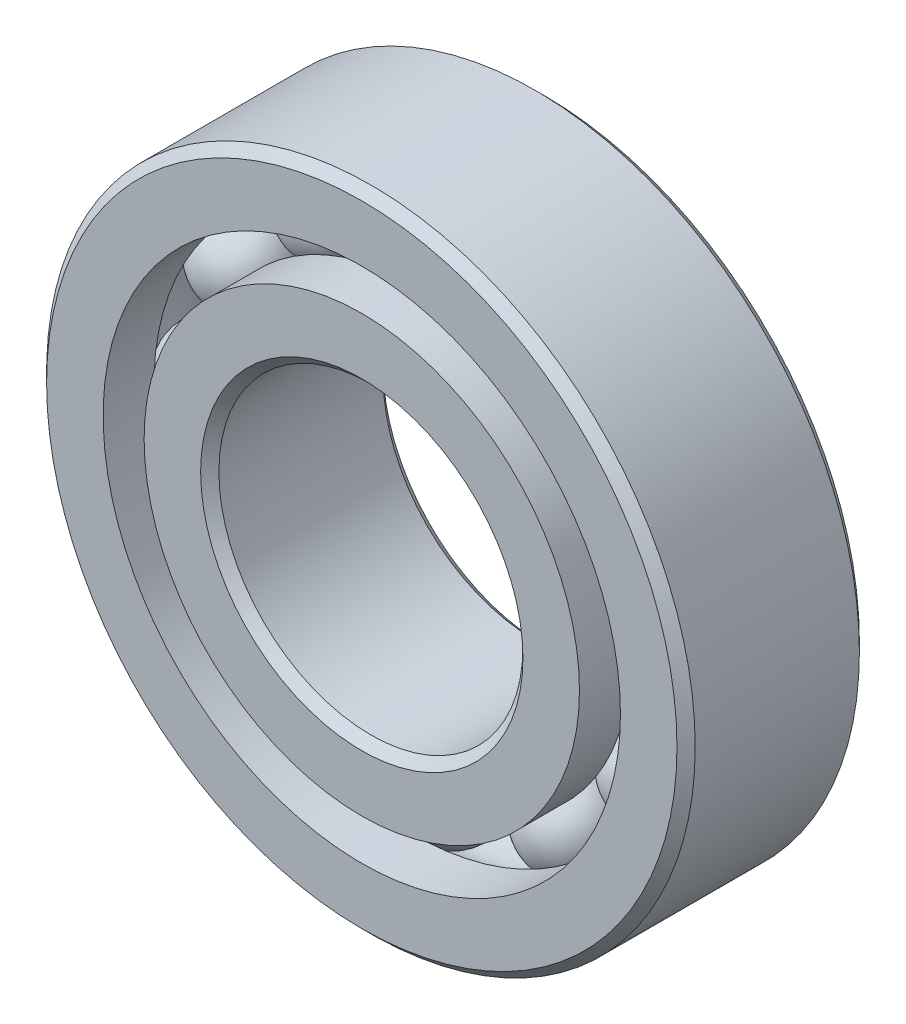
ISO-10303-21;
HEADER;
FILE_DESCRIPTION(('STEP AP214'),'2;1');
FILE_NAME('part.step','',(''),(''),'','','');
FILE_SCHEMA(('AUTOMOTIVE_DESIGN { 1 0 10303 214 1 1 1 1 }'));
ENDSEC;
DATA;
#1=APPLICATION_CONTEXT('core data for automotive mechanical design processes');
#2=APPLICATION_PROTOCOL_DEFINITION('international standard','automotive_design',2000,#1);
#3=PRODUCT_CONTEXT('',#1,'mechanical');
#4=PRODUCT('Part','Part','',(#3));
#5=PRODUCT_RELATED_PRODUCT_CATEGORY('part','',(#4));
#6=PRODUCT_DEFINITION_FORMATION('','',#4);
#7=PRODUCT_DEFINITION_CONTEXT('part definition',#1,'design');
#8=PRODUCT_DEFINITION('design','',#6,#7);
#9=PRODUCT_DEFINITION_SHAPE('','',#8);
#10=(LENGTH_UNIT() NAMED_UNIT(*) SI_UNIT(.MILLI.,.METRE.));
#11=(NAMED_UNIT(*) PLANE_ANGLE_UNIT() SI_UNIT($,.RADIAN.));
#12=(NAMED_UNIT(*) SI_UNIT($,.STERADIAN.) SOLID_ANGLE_UNIT());
#13=UNCERTAINTY_MEASURE_WITH_UNIT(LENGTH_MEASURE(1.E-05),#10,'distance_accuracy_value','');
#14=(GEOMETRIC_REPRESENTATION_CONTEXT(3) GLOBAL_UNCERTAINTY_ASSIGNED_CONTEXT((#13)) GLOBAL_UNIT_ASSIGNED_CONTEXT((#10,
#11,#12)) REPRESENTATION_CONTEXT('',''));
#15=CARTESIAN_POINT('',(0.,0.,0.));
#16=DIRECTION('',(0.,0.,1.));
#17=DIRECTION('',(1.,0.,0.));
#18=AXIS2_PLACEMENT_3D('',#15,#16,#17);
#19=CARTESIAN_POINT('',(-5.87499999999987,10.1757984944672,0.));
#20=DIRECTION('',(0.,0.,1.));
#21=DIRECTION('',(-0.499999999999989,0.866025403784445,0.));
#22=AXIS2_PLACEMENT_3D('',#19,#20,#21);
#23=SPHERICAL_SURFACE('',#22,2.24100396705149);
#24=CARTESIAN_POINT('',(-5.87499999999987,10.1757984944672,2.24100396705149));
#25=VERTEX_POINT('',#24);
#26=VERTEX_LOOP('',#25);
#27=FACE_BOUND('',#26,.T.);
#28=ADVANCED_FACE('F39',(#27),#23,.T.);
#29=CLOSED_SHELL('',(#28));
#30=MANIFOLD_SOLID_BREP('B2',#29);
#31=CARTESIAN_POINT('',(-10.1757984944671,5.87500000000012,0.));
#32=DIRECTION('',(0.,0.,1.));
#33=DIRECTION('',(-0.866025403784433,0.50000000000001,0.));
#34=AXIS2_PLACEMENT_3D('',#31,#32,#33);
#35=SPHERICAL_SURFACE('',#34,2.24100396705149);
#36=CARTESIAN_POINT('',(-10.1757984944671,5.87500000000012,2.24100396705149));
#37=VERTEX_POINT('',#36);
#38=VERTEX_LOOP('',#37);
#39=FACE_BOUND('',#38,.T.);
#40=ADVANCED_FACE('F59',(#39),#35,.T.);
#41=CLOSED_SHELL('',(#40));
#42=MANIFOLD_SOLID_BREP('B6',#41);
#43=CARTESIAN_POINT('',(-11.75,1.2307471719422E-13,0.));
#44=DIRECTION('',(0.,0.,1.));
#45=DIRECTION('',(-1.,0.,0.));
#46=AXIS2_PLACEMENT_3D('',#43,#44,#45);
#47=SPHERICAL_SURFACE('',#46,2.24100396705149);
#48=CARTESIAN_POINT('',(-11.75,1.2307471719422E-13,2.24100396705149));
#49=VERTEX_POINT('',#48);
#50=VERTEX_LOOP('',#49);
#51=FACE_BOUND('',#50,.T.);
#52=ADVANCED_FACE('F79',(#51),#47,.T.);
#53=CLOSED_SHELL('',(#52));
#54=MANIFOLD_SOLID_BREP('B35',#53);
#55=CARTESIAN_POINT('',(-10.1757984944672,-5.87499999999991,0.));
#56=DIRECTION('',(0.,0.,1.));
#57=DIRECTION('',(-0.866025403784443,-0.499999999999992,0.));
#58=AXIS2_PLACEMENT_3D('',#55,#56,#57);
#59=SPHERICAL_SURFACE('',#58,2.24100396705149);
#60=CARTESIAN_POINT('',(-10.1757984944672,-5.87499999999991,2.24100396705149));
#61=VERTEX_POINT('',#60);
#62=VERTEX_LOOP('',#61);
#63=FACE_BOUND('',#62,.T.);
#64=ADVANCED_FACE('F99',(#63),#59,.T.);
#65=CLOSED_SHELL('',(#64));
#66=MANIFOLD_SOLID_BREP('B55',#65);
#67=CARTESIAN_POINT('',(-5.87500000000008,-10.1757984944671,0.));
#68=DIRECTION('',(0.,0.,1.));
#69=DIRECTION('',(-0.500000000000007,-0.866025403784435,0.));
#70=AXIS2_PLACEMENT_3D('',#67,#68,#69);
#71=SPHERICAL_SURFACE('',#70,2.24100396705149);
#72=CARTESIAN_POINT('',(-5.87500000000008,-10.1757984944671,2.24100396705149));
#73=VERTEX_POINT('',#72);
#74=VERTEX_LOOP('',#73);
#75=FACE_BOUND('',#74,.T.);
#76=ADVANCED_FACE('F119',(#75),#71,.T.);
#77=CLOSED_SHELL('',(#76));
#78=MANIFOLD_SOLID_BREP('B75',#77);
#79=CARTESIAN_POINT('',(0.,-11.75,0.));
#80=DIRECTION('',(0.,0.,1.));
#81=DIRECTION('',(0.,-1.,0.));
#82=AXIS2_PLACEMENT_3D('',#79,#80,#81);
#83=SPHERICAL_SURFACE('',#82,2.24100396705149);
#84=CARTESIAN_POINT('',(0.,-11.75,2.24100396705149));
#85=VERTEX_POINT('',#84);
#86=VERTEX_LOOP('',#85);
#87=FACE_BOUND('',#86,.T.);
#88=ADVANCED_FACE('F139',(#87),#83,.T.);
#89=CLOSED_SHELL('',(#88));
#90=MANIFOLD_SOLID_BREP('B95',#89);
#91=CARTESIAN_POINT('',(5.87499999999994,-10.1757984944672,0.));
#92=DIRECTION('',(0.,0.,1.));
#93=DIRECTION('',(0.499999999999995,-0.866025403784442,0.));
#94=AXIS2_PLACEMENT_3D('',#91,#92,#93);
#95=SPHERICAL_SURFACE('',#94,2.24100396705149);
#96=CARTESIAN_POINT('',(5.87499999999994,-10.1757984944672,2.24100396705149));
#97=VERTEX_POINT('',#96);
#98=VERTEX_LOOP('',#97);
#99=FACE_BOUND('',#98,.T.);
#100=ADVANCED_FACE('F159',(#99),#95,.T.);
#101=CLOSED_SHELL('',(#100));
#102=MANIFOLD_SOLID_BREP('B115',#101);
#103=CARTESIAN_POINT('',(10.1757984944671,-5.87500000000005,0.));
#104=DIRECTION('',(0.,0.,1.));
#105=DIRECTION('',(0.866025403784436,-0.500000000000004,0.));
#106=AXIS2_PLACEMENT_3D('',#103,#104,#105);
#107=SPHERICAL_SURFACE('',#106,2.24100396705149);
#108=CARTESIAN_POINT('',(10.1757984944671,-5.87500000000005,2.24100396705149));
#109=VERTEX_POINT('',#108);
#110=VERTEX_LOOP('',#109);
#111=FACE_BOUND('',#110,.T.);
#112=ADVANCED_FACE('F179',(#111),#107,.T.);
#113=CLOSED_SHELL('',(#112));
#114=MANIFOLD_SOLID_BREP('B135',#113);
#115=CARTESIAN_POINT('',(11.75,0.,0.));
#116=DIRECTION('',(0.,0.,1.));
#117=DIRECTION('',(1.,0.,0.));
#118=AXIS2_PLACEMENT_3D('',#115,#116,#117);
#119=SPHERICAL_SURFACE('',#118,2.24100396705149);
#120=CARTESIAN_POINT('',(11.75,0.,2.24100396705149));
#121=VERTEX_POINT('',#120);
#122=VERTEX_LOOP('',#121);
#123=FACE_BOUND('',#122,.T.);
#124=ADVANCED_FACE('F199',(#123),#119,.T.);
#125=CLOSED_SHELL('',(#124));
#126=MANIFOLD_SOLID_BREP('B155',#125);
#127=CARTESIAN_POINT('',(10.1757984944672,5.87499999999998,0.));
#128=DIRECTION('',(0.,0.,1.));
#129=DIRECTION('',(0.86602540378444,0.499999999999998,0.));
#130=AXIS2_PLACEMENT_3D('',#127,#128,#129);
#131=SPHERICAL_SURFACE('',#130,2.24100396705149);
#132=CARTESIAN_POINT('',(10.1757984944672,5.87499999999998,2.24100396705149));
#133=VERTEX_POINT('',#132);
#134=VERTEX_LOOP('',#133);
#135=FACE_BOUND('',#134,.T.);
#136=ADVANCED_FACE('F219',(#135),#131,.T.);
#137=CLOSED_SHELL('',(#136));
#138=MANIFOLD_SOLID_BREP('B175',#137);
#139=CARTESIAN_POINT('',(5.87500000000001,10.1757984944671,0.));
#140=DIRECTION('',(0.,0.,1.));
#141=DIRECTION('',(0.500000000000001,0.866025403784438,0.));
#142=AXIS2_PLACEMENT_3D('',#139,#140,#141);
#143=SPHERICAL_SURFACE('',#142,2.24100396705149);
#144=CARTESIAN_POINT('',(5.87500000000001,10.1757984944671,2.24100396705149));
#145=VERTEX_POINT('',#144);
#146=VERTEX_LOOP('',#145);
#147=FACE_BOUND('',#146,.T.);
#148=ADVANCED_FACE('F239',(#147),#143,.T.);
#149=CLOSED_SHELL('',(#148));
#150=MANIFOLD_SOLID_BREP('B195',#149);
#151=CARTESIAN_POINT('',(0.,11.75,0.));
#152=DIRECTION('',(0.,0.,1.));
#153=DIRECTION('',(0.,1.,0.));
#154=AXIS2_PLACEMENT_3D('',#151,#152,#153);
#155=SPHERICAL_SURFACE('',#154,2.24100396705149);
#156=CARTESIAN_POINT('',(0.,11.75,2.24100396705149));
#157=VERTEX_POINT('',#156);
#158=VERTEX_LOOP('',#157);
#159=FACE_BOUND('',#158,.T.);
#160=ADVANCED_FACE('F261',(#159),#155,.T.);
#161=CLOSED_SHELL('',(#160));
#162=MANIFOLD_SOLID_BREP('B215',#161);
#163=CARTESIAN_POINT('',(0.,10.739010989011,4.5));
#164=DIRECTION('',(0.,0.,-1.));
#165=DIRECTION('',(-1.,0.,0.));
#166=AXIS2_PLACEMENT_3D('',#163,#164,#165);
#167=PLANE('',#166);
#168=CARTESIAN_POINT('',(0.,0.,4.5));
#169=DIRECTION('',(0.,0.,1.));
#170=DIRECTION('',(1.,0.,0.));
#171=AXIS2_PLACEMENT_3D('',#168,#169,#170);
#172=CIRCLE('',#171,7.95);
#173=CARTESIAN_POINT('',(7.95,0.,4.5));
#174=VERTEX_POINT('',#173);
#175=EDGE_CURVE('E308',#174,#174,#172,.T.);
#176=ORIENTED_EDGE('',*,*,#175,.F.);
#177=EDGE_LOOP('',(#176));
#178=FACE_BOUND('',#177,.T.);
#179=CARTESIAN_POINT('',(0.,0.,4.5));
#180=DIRECTION('',(0.,0.,1.));
#181=DIRECTION('',(1.,0.,0.));
#182=AXIS2_PLACEMENT_3D('',#179,#180,#181);
#183=CIRCLE('',#182,10.739010989011);
#184=CARTESIAN_POINT('',(10.739010989011,0.,4.5));
#185=VERTEX_POINT('',#184);
#186=EDGE_CURVE('E260',#185,#185,#183,.T.);
#187=ORIENTED_EDGE('',*,*,#186,.T.);
#188=EDGE_LOOP('',(#187));
#189=FACE_BOUND('',#188,.T.);
#190=ADVANCED_FACE('F280',(#178,#189),#167,.F.);
#191=CARTESIAN_POINT('',(0.,0.,4.5));
#192=DIRECTION('',(0.,0.,1.));
#193=DIRECTION('',(1.,0.,0.));
#194=AXIS2_PLACEMENT_3D('',#191,#192,#193);
#195=CYLINDRICAL_SURFACE('',#194,10.739010989011);
#196=ORIENTED_EDGE('',*,*,#186,.F.);
#197=EDGE_LOOP('',(#196));
#198=FACE_BOUND('',#197,.T.);
#199=CARTESIAN_POINT('',(0.,0.,2.));
#200=DIRECTION('',(0.,0.,1.));
#201=DIRECTION('',(1.,0.,0.));
#202=AXIS2_PLACEMENT_3D('',#199,#200,#201);
#203=CIRCLE('',#202,10.739010989011);
#204=CARTESIAN_POINT('',(10.739010989011,0.,2.));
#205=VERTEX_POINT('',#204);
#206=EDGE_CURVE('E286',#205,#205,#203,.T.);
#207=ORIENTED_EDGE('',*,*,#206,.T.);
#208=EDGE_LOOP('',(#207));
#209=FACE_BOUND('',#208,.T.);
#210=ADVANCED_FACE('F315',(#198,#209),#195,.T.);
#211=CARTESIAN_POINT('',(0.,0.,0.));
#212=DIRECTION('',(0.,0.,1.));
#213=DIRECTION('',(1.,0.,0.));
#214=AXIS2_PLACEMENT_3D('',#211,#212,#213);
#215=TOROIDAL_SURFACE('',#214,11.75,2.24100396705149);
#216=ORIENTED_EDGE('',*,*,#206,.F.);
#217=EDGE_LOOP('',(#216));
#218=FACE_BOUND('',#217,.T.);
#219=CARTESIAN_POINT('',(0.,0.,-2.));
#220=DIRECTION('',(0.,0.,1.));
#221=DIRECTION('',(1.,0.,0.));
#222=AXIS2_PLACEMENT_3D('',#219,#220,#221);
#223=CIRCLE('',#222,10.739010989011);
#224=CARTESIAN_POINT('',(10.739010989011,0.,-2.));
#225=VERTEX_POINT('',#224);
#226=EDGE_CURVE('E290',#225,#225,#223,.T.);
#227=ORIENTED_EDGE('',*,*,#226,.T.);
#228=EDGE_LOOP('',(#227));
#229=FACE_BOUND('',#228,.T.);
#230=ADVANCED_FACE('F319',(#218,#229),#215,.F.);
#231=CARTESIAN_POINT('',(0.,0.,4.5));
#232=DIRECTION('',(0.,0.,1.));
#233=DIRECTION('',(1.,0.,0.));
#234=AXIS2_PLACEMENT_3D('',#231,#232,#233);
#235=CYLINDRICAL_SURFACE('',#234,10.739010989011);
#236=ORIENTED_EDGE('',*,*,#226,.F.);
#237=EDGE_LOOP('',(#236));
#238=FACE_BOUND('',#237,.T.);
#239=CARTESIAN_POINT('',(0.,0.,-4.5));
#240=DIRECTION('',(0.,0.,1.));
#241=DIRECTION('',(1.,0.,0.));
#242=AXIS2_PLACEMENT_3D('',#239,#240,#241);
#243=CIRCLE('',#242,10.739010989011);
#244=CARTESIAN_POINT('',(10.739010989011,0.,-4.5));
#245=VERTEX_POINT('',#244);
#246=EDGE_CURVE('E294',#245,#245,#243,.T.);
#247=ORIENTED_EDGE('',*,*,#246,.T.);
#248=EDGE_LOOP('',(#247));
#249=FACE_BOUND('',#248,.T.);
#250=ADVANCED_FACE('F324',(#238,#249),#235,.T.);
#251=CARTESIAN_POINT('',(0.,7.95,-4.5));
#252=DIRECTION('',(0.,0.,1.));
#253=DIRECTION('',(1.,0.,0.));
#254=AXIS2_PLACEMENT_3D('',#251,#252,#253);
#255=PLANE('',#254);
#256=ORIENTED_EDGE('',*,*,#246,.F.);
#257=EDGE_LOOP('',(#256));
#258=FACE_BOUND('',#257,.T.);
#259=CARTESIAN_POINT('',(0.,0.,-4.5));
#260=DIRECTION('',(0.,0.,1.));
#261=DIRECTION('',(1.,0.,0.));
#262=AXIS2_PLACEMENT_3D('',#259,#260,#261);
#263=CIRCLE('',#262,7.95);
#264=CARTESIAN_POINT('',(7.95,0.,-4.5));
#265=VERTEX_POINT('',#264);
#266=EDGE_CURVE('E299',#265,#265,#263,.T.);
#267=ORIENTED_EDGE('',*,*,#266,.T.);
#268=EDGE_LOOP('',(#267));
#269=FACE_BOUND('',#268,.T.);
#270=ADVANCED_FACE('F330',(#258,#269),#255,.F.);
#271=CARTESIAN_POINT('',(0.,0.,-4.05));
#272=DIRECTION('',(0.,0.,-1.));
#273=DIRECTION('',(-1.,0.,0.));
#274=AXIS2_PLACEMENT_3D('',#271,#272,#273);
#275=CONICAL_SURFACE('',#274,7.5,0.785398163397446);
#276=ORIENTED_EDGE('',*,*,#266,.F.);
#277=EDGE_LOOP('',(#276));
#278=FACE_BOUND('',#277,.T.);
#279=CARTESIAN_POINT('',(0.,0.,-4.05));
#280=DIRECTION('',(0.,0.,1.));
#281=DIRECTION('',(1.,0.,0.));
#282=AXIS2_PLACEMENT_3D('',#279,#280,#281);
#283=CIRCLE('',#282,7.5);
#284=CARTESIAN_POINT('',(7.5,0.,-4.05));
#285=VERTEX_POINT('',#284);
#286=EDGE_CURVE('E302',#285,#285,#283,.T.);
#287=ORIENTED_EDGE('',*,*,#286,.T.);
#288=EDGE_LOOP('',(#287));
#289=FACE_BOUND('',#288,.T.);
#290=ADVANCED_FACE('F334',(#278,#289),#275,.F.);
#291=CARTESIAN_POINT('',(0.,0.,4.5));
#292=DIRECTION('',(0.,0.,1.));
#293=DIRECTION('',(1.,0.,0.));
#294=AXIS2_PLACEMENT_3D('',#291,#292,#293);
#295=CYLINDRICAL_SURFACE('',#294,7.5);
#296=ORIENTED_EDGE('',*,*,#286,.F.);
#297=EDGE_LOOP('',(#296));
#298=FACE_BOUND('',#297,.T.);
#299=CARTESIAN_POINT('',(0.,0.,4.05));
#300=DIRECTION('',(0.,0.,1.));
#301=DIRECTION('',(1.,0.,0.));
#302=AXIS2_PLACEMENT_3D('',#299,#300,#301);
#303=CIRCLE('',#302,7.5);
#304=CARTESIAN_POINT('',(7.5,0.,4.05));
#305=VERTEX_POINT('',#304);
#306=EDGE_CURVE('E305',#305,#305,#303,.T.);
#307=ORIENTED_EDGE('',*,*,#306,.T.);
#308=EDGE_LOOP('',(#307));
#309=FACE_BOUND('',#308,.T.);
#310=ADVANCED_FACE('F338',(#298,#309),#295,.F.);
#311=CARTESIAN_POINT('',(0.,0.,4.5));
#312=DIRECTION('',(0.,0.,1.));
#313=DIRECTION('',(1.,0.,0.));
#314=AXIS2_PLACEMENT_3D('',#311,#312,#313);
#315=CONICAL_SURFACE('',#314,7.95,0.785398163397451);
#316=ORIENTED_EDGE('',*,*,#306,.F.);
#317=EDGE_LOOP('',(#316));
#318=FACE_BOUND('',#317,.T.);
#319=ORIENTED_EDGE('',*,*,#175,.T.);
#320=EDGE_LOOP('',(#319));
#321=FACE_BOUND('',#320,.T.);
#322=ADVANCED_FACE('F312',(#318,#321),#315,.F.);
#323=CLOSED_SHELL('',(#190,#210,#230,#250,#270,#290,#310,#322));
#324=MANIFOLD_SOLID_BREP('B235',#323);
#325=CARTESIAN_POINT('',(0.,0.,4.05));
#326=DIRECTION('',(0.,0.,-1.));
#327=DIRECTION('',(-1.,0.,0.));
#328=AXIS2_PLACEMENT_3D('',#325,#326,#327);
#329=CONICAL_SURFACE('',#328,16.,0.785398163397447);
#330=CARTESIAN_POINT('',(0.,0.,4.5));
#331=DIRECTION('',(0.,0.,1.));
#332=DIRECTION('',(1.,0.,0.));
#333=AXIS2_PLACEMENT_3D('',#330,#331,#332);
#334=CIRCLE('',#333,15.55);
#335=CARTESIAN_POINT('',(15.55,0.,4.5));
#336=VERTEX_POINT('',#335);
#337=EDGE_CURVE('E429',#336,#336,#334,.T.);
#338=ORIENTED_EDGE('',*,*,#337,.F.);
#339=EDGE_LOOP('',(#338));
#340=FACE_BOUND('',#339,.T.);
#341=CARTESIAN_POINT('',(0.,0.,4.05));
#342=DIRECTION('',(0.,0.,1.));
#343=DIRECTION('',(1.,0.,0.));
#344=AXIS2_PLACEMENT_3D('',#341,#342,#343);
#345=CIRCLE('',#344,16.);
#346=CARTESIAN_POINT('',(16.,0.,4.05));
#347=VERTEX_POINT('',#346);
#348=EDGE_CURVE('E279',#347,#347,#345,.T.);
#349=ORIENTED_EDGE('',*,*,#348,.T.);
#350=EDGE_LOOP('',(#349));
#351=FACE_BOUND('',#350,.T.);
#352=ADVANCED_FACE('F401',(#340,#351),#329,.T.);
#353=CARTESIAN_POINT('',(0.,0.,4.5));
#354=DIRECTION('',(0.,0.,1.));
#355=DIRECTION('',(1.,0.,0.));
#356=AXIS2_PLACEMENT_3D('',#353,#354,#355);
#357=CYLINDRICAL_SURFACE('',#356,16.);
#358=ORIENTED_EDGE('',*,*,#348,.F.);
#359=EDGE_LOOP('',(#358));
#360=FACE_BOUND('',#359,.T.);
#361=CARTESIAN_POINT('',(0.,0.,-4.05));
#362=DIRECTION('',(0.,0.,1.));
#363=DIRECTION('',(1.,0.,0.));
#364=AXIS2_PLACEMENT_3D('',#361,#362,#363);
#365=CIRCLE('',#364,16.);
#366=CARTESIAN_POINT('',(16.,0.,-4.05));
#367=VERTEX_POINT('',#366);
#368=EDGE_CURVE('E407',#367,#367,#365,.T.);
#369=ORIENTED_EDGE('',*,*,#368,.T.);
#370=EDGE_LOOP('',(#369));
#371=FACE_BOUND('',#370,.T.);
#372=ADVANCED_FACE('F436',(#360,#371),#357,.T.);
#373=CARTESIAN_POINT('',(0.,0.,-4.5));
#374=DIRECTION('',(0.,0.,1.));
#375=DIRECTION('',(1.,0.,0.));
#376=AXIS2_PLACEMENT_3D('',#373,#374,#375);
#377=CONICAL_SURFACE('',#376,15.55,0.785398163397446);
#378=ORIENTED_EDGE('',*,*,#368,.F.);
#379=EDGE_LOOP('',(#378));
#380=FACE_BOUND('',#379,.T.);
#381=CARTESIAN_POINT('',(0.,0.,-4.5));
#382=DIRECTION('',(0.,0.,1.));
#383=DIRECTION('',(1.,0.,0.));
#384=AXIS2_PLACEMENT_3D('',#381,#382,#383);
#385=CIRCLE('',#384,15.55);
#386=CARTESIAN_POINT('',(15.55,0.,-4.5));
#387=VERTEX_POINT('',#386);
#388=EDGE_CURVE('E411',#387,#387,#385,.T.);
#389=ORIENTED_EDGE('',*,*,#388,.T.);
#390=EDGE_LOOP('',(#389));
#391=FACE_BOUND('',#390,.T.);
#392=ADVANCED_FACE('F440',(#380,#391),#377,.T.);
#393=CARTESIAN_POINT('',(0.,15.55,-4.5));
#394=DIRECTION('',(0.,0.,1.));
#395=DIRECTION('',(1.,0.,0.));
#396=AXIS2_PLACEMENT_3D('',#393,#394,#395);
#397=PLANE('',#396);
#398=ORIENTED_EDGE('',*,*,#388,.F.);
#399=EDGE_LOOP('',(#398));
#400=FACE_BOUND('',#399,.T.);
#401=CARTESIAN_POINT('',(0.,0.,-4.5));
#402=DIRECTION('',(0.,0.,1.));
#403=DIRECTION('',(1.,0.,0.));
#404=AXIS2_PLACEMENT_3D('',#401,#402,#403);
#405=CIRCLE('',#404,12.760989010989);
#406=CARTESIAN_POINT('',(12.760989010989,0.,-4.5));
#407=VERTEX_POINT('',#406);
#408=EDGE_CURVE('E415',#407,#407,#405,.T.);
#409=ORIENTED_EDGE('',*,*,#408,.T.);
#410=EDGE_LOOP('',(#409));
#411=FACE_BOUND('',#410,.T.);
#412=ADVANCED_FACE('F445',(#400,#411),#397,.F.);
#413=CARTESIAN_POINT('',(0.,0.,4.5));
#414=DIRECTION('',(0.,0.,1.));
#415=DIRECTION('',(1.,0.,0.));
#416=AXIS2_PLACEMENT_3D('',#413,#414,#415);
#417=CYLINDRICAL_SURFACE('',#416,12.760989010989);
#418=ORIENTED_EDGE('',*,*,#408,.F.);
#419=EDGE_LOOP('',(#418));
#420=FACE_BOUND('',#419,.T.);
#421=CARTESIAN_POINT('',(0.,0.,-2.));
#422=DIRECTION('',(0.,0.,1.));
#423=DIRECTION('',(1.,0.,0.));
#424=AXIS2_PLACEMENT_3D('',#421,#422,#423);
#425=CIRCLE('',#424,12.760989010989);
#426=CARTESIAN_POINT('',(12.760989010989,0.,-2.));
#427=VERTEX_POINT('',#426);
#428=EDGE_CURVE('E420',#427,#427,#425,.T.);
#429=ORIENTED_EDGE('',*,*,#428,.T.);
#430=EDGE_LOOP('',(#429));
#431=FACE_BOUND('',#430,.T.);
#432=ADVANCED_FACE('F451',(#420,#431),#417,.F.);
#433=CARTESIAN_POINT('',(0.,0.,0.));
#434=DIRECTION('',(0.,0.,1.));
#435=DIRECTION('',(1.,0.,0.));
#436=AXIS2_PLACEMENT_3D('',#433,#434,#435);
#437=TOROIDAL_SURFACE('',#436,11.75,2.24100396705149);
#438=ORIENTED_EDGE('',*,*,#428,.F.);
#439=EDGE_LOOP('',(#438));
#440=FACE_BOUND('',#439,.T.);
#441=CARTESIAN_POINT('',(0.,0.,2.));
#442=DIRECTION('',(0.,0.,1.));
#443=DIRECTION('',(1.,0.,0.));
#444=AXIS2_PLACEMENT_3D('',#441,#442,#443);
#445=CIRCLE('',#444,12.760989010989);
#446=CARTESIAN_POINT('',(12.760989010989,0.,2.));
#447=VERTEX_POINT('',#446);
#448=EDGE_CURVE('E423',#447,#447,#445,.T.);
#449=ORIENTED_EDGE('',*,*,#448,.T.);
#450=EDGE_LOOP('',(#449));
#451=FACE_BOUND('',#450,.T.);
#452=ADVANCED_FACE('F455',(#440,#451),#437,.F.);
#453=CARTESIAN_POINT('',(0.,0.,4.5));
#454=DIRECTION('',(0.,0.,1.));
#455=DIRECTION('',(1.,0.,0.));
#456=AXIS2_PLACEMENT_3D('',#453,#454,#455);
#457=CYLINDRICAL_SURFACE('',#456,12.760989010989);
#458=ORIENTED_EDGE('',*,*,#448,.F.);
#459=EDGE_LOOP('',(#458));
#460=FACE_BOUND('',#459,.T.);
#461=CARTESIAN_POINT('',(0.,0.,4.5));
#462=DIRECTION('',(0.,0.,1.));
#463=DIRECTION('',(1.,0.,0.));
#464=AXIS2_PLACEMENT_3D('',#461,#462,#463);
#465=CIRCLE('',#464,12.760989010989);
#466=CARTESIAN_POINT('',(12.760989010989,0.,4.5));
#467=VERTEX_POINT('',#466);
#468=EDGE_CURVE('E426',#467,#467,#465,.T.);
#469=ORIENTED_EDGE('',*,*,#468,.T.);
#470=EDGE_LOOP('',(#469));
#471=FACE_BOUND('',#470,.T.);
#472=ADVANCED_FACE('F459',(#460,#471),#457,.F.);
#473=CARTESIAN_POINT('',(0.,15.55,4.5));
#474=DIRECTION('',(0.,0.,-1.));
#475=DIRECTION('',(-1.,0.,0.));
#476=AXIS2_PLACEMENT_3D('',#473,#474,#475);
#477=PLANE('',#476);
#478=ORIENTED_EDGE('',*,*,#468,.F.);
#479=EDGE_LOOP('',(#478));
#480=FACE_BOUND('',#479,.T.);
#481=ORIENTED_EDGE('',*,*,#337,.T.);
#482=EDGE_LOOP('',(#481));
#483=FACE_BOUND('',#482,.T.);
#484=ADVANCED_FACE('F433',(#480,#483),#477,.F.);
#485=CLOSED_SHELL('',(#352,#372,#392,#412,#432,#452,#472,#484));
#486=MANIFOLD_SOLID_BREP('B255',#485);
#487=ADVANCED_BREP_SHAPE_REPRESENTATION('',(#18,#30,#42,#54,#66,#78,#90,#102,#114,#126,#138,
#150,#162,#324,#486),#14);
#488=SHAPE_DEFINITION_REPRESENTATION(#9,#487);
ENDSEC;
END-ISO-10303-21;
